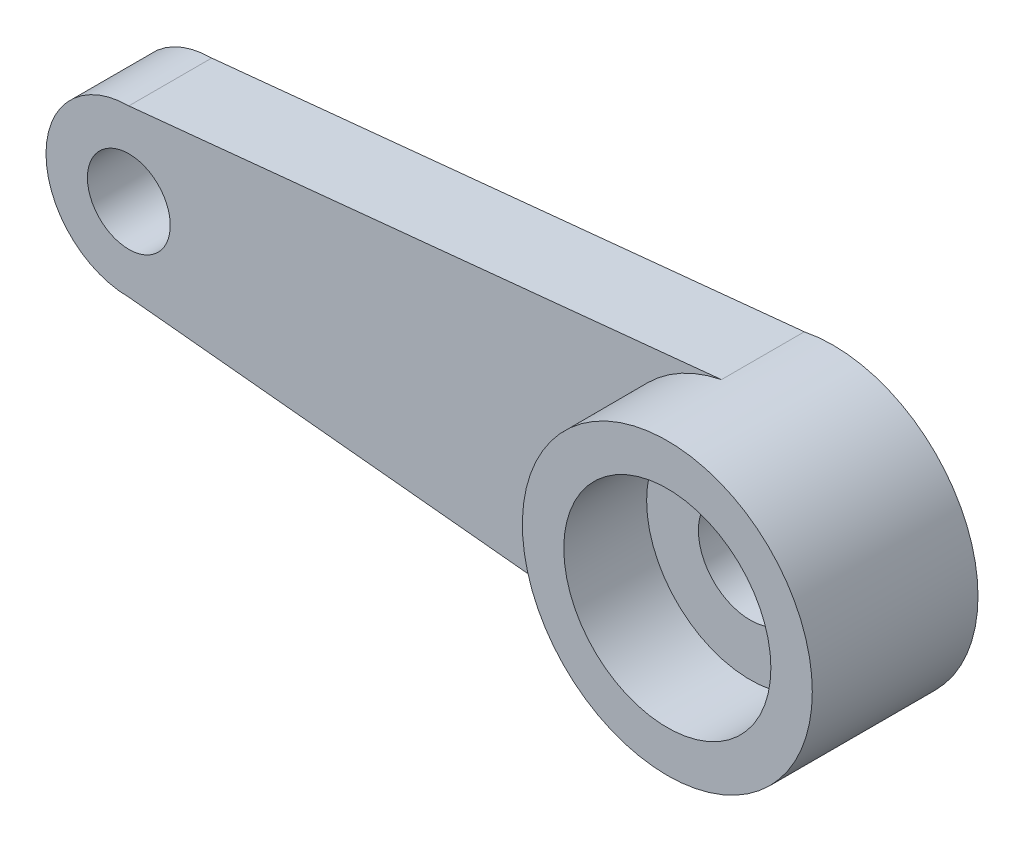
ISO-10303-21;
HEADER;
FILE_DESCRIPTION(('STEP AP214'),'2;1');
FILE_NAME('part.step','',(''),(''),'','','');
FILE_SCHEMA(('AUTOMOTIVE_DESIGN { 1 0 10303 214 1 1 1 1 }'));
ENDSEC;
DATA;
#1=APPLICATION_CONTEXT('core data for automotive mechanical design processes');
#2=APPLICATION_PROTOCOL_DEFINITION('international standard','automotive_design',2000,#1);
#3=PRODUCT_CONTEXT('',#1,'mechanical');
#4=PRODUCT('Part','Part','',(#3));
#5=PRODUCT_RELATED_PRODUCT_CATEGORY('part','',(#4));
#6=PRODUCT_DEFINITION_FORMATION('','',#4);
#7=PRODUCT_DEFINITION_CONTEXT('part definition',#1,'design');
#8=PRODUCT_DEFINITION('design','',#6,#7);
#9=PRODUCT_DEFINITION_SHAPE('','',#8);
#10=(LENGTH_UNIT() NAMED_UNIT(*) SI_UNIT(.MILLI.,.METRE.));
#11=(NAMED_UNIT(*) PLANE_ANGLE_UNIT() SI_UNIT($,.RADIAN.));
#12=(NAMED_UNIT(*) SI_UNIT($,.STERADIAN.) SOLID_ANGLE_UNIT());
#13=UNCERTAINTY_MEASURE_WITH_UNIT(LENGTH_MEASURE(1.E-05),#10,'distance_accuracy_value','');
#14=(GEOMETRIC_REPRESENTATION_CONTEXT(3) GLOBAL_UNCERTAINTY_ASSIGNED_CONTEXT((#13)) GLOBAL_UNIT_ASSIGNED_CONTEXT((#10,
#11,#12)) REPRESENTATION_CONTEXT('',''));
#15=CARTESIAN_POINT('',(0.,0.,0.));
#16=DIRECTION('',(0.,0.,1.));
#17=DIRECTION('',(1.,0.,0.));
#18=AXIS2_PLACEMENT_3D('',#15,#16,#17);
#19=CARTESIAN_POINT('',(0.,0.,4.));
#20=DIRECTION('',(0.,0.,-1.));
#21=DIRECTION('',(-1.,0.,0.));
#22=AXIS2_PLACEMENT_3D('',#19,#20,#21);
#23=CYLINDRICAL_SURFACE('',#22,2.5);
#24=CARTESIAN_POINT('',(0.,0.,4.));
#25=DIRECTION('',(0.,0.,1.));
#26=DIRECTION('',(1.,0.,0.));
#27=AXIS2_PLACEMENT_3D('',#24,#25,#26);
#28=CIRCLE('',#27,2.5);
#29=CARTESIAN_POINT('',(2.5,0.,4.));
#30=VERTEX_POINT('',#29);
#31=EDGE_CURVE('E115',#30,#30,#28,.T.);
#32=ORIENTED_EDGE('',*,*,#31,.T.);
#33=EDGE_LOOP('',(#32));
#34=FACE_BOUND('',#33,.T.);
#35=CARTESIAN_POINT('',(0.,0.,2.));
#36=DIRECTION('',(0.,0.,-1.));
#37=DIRECTION('',(-1.,0.,0.));
#38=AXIS2_PLACEMENT_3D('',#35,#36,#37);
#39=CIRCLE('',#38,2.5);
#40=CARTESIAN_POINT('',(-2.5,0.,2.));
#41=VERTEX_POINT('',#40);
#42=EDGE_CURVE('E109',#41,#41,#39,.T.);
#43=ORIENTED_EDGE('',*,*,#42,.T.);
#44=EDGE_LOOP('',(#43));
#45=FACE_BOUND('',#44,.T.);
#46=ADVANCED_FACE('F34',(#34,#45),#23,.F.);
#47=CARTESIAN_POINT('',(0.,0.,4.));
#48=DIRECTION('',(0.,0.,1.));
#49=DIRECTION('',(1.,0.,0.));
#50=AXIS2_PLACEMENT_3D('',#47,#48,#49);
#51=PLANE('',#50);
#52=CARTESIAN_POINT('',(0.,0.,4.));
#53=DIRECTION('',(0.,0.,1.));
#54=DIRECTION('',(1.,0.,0.));
#55=AXIS2_PLACEMENT_3D('',#52,#53,#54);
#56=CIRCLE('',#55,3.5);
#57=CARTESIAN_POINT('',(3.5,0.,4.));
#58=VERTEX_POINT('',#57);
#59=EDGE_CURVE('E11',#58,#58,#56,.T.);
#60=ORIENTED_EDGE('',*,*,#59,.T.);
#61=EDGE_LOOP('',(#60));
#62=FACE_BOUND('',#61,.T.);
#63=ORIENTED_EDGE('',*,*,#31,.F.);
#64=EDGE_LOOP('',(#63));
#65=FACE_BOUND('',#64,.T.);
#66=ADVANCED_FACE('F141',(#62,#65),#51,.T.);
#67=CARTESIAN_POINT('',(0.,0.,0.));
#68=DIRECTION('',(0.,0.,1.));
#69=DIRECTION('',(1.,0.,0.));
#70=AXIS2_PLACEMENT_3D('',#67,#68,#69);
#71=PLANE('',#70);
#72=CARTESIAN_POINT('',(0.,0.,0.));
#73=DIRECTION('',(0.,0.,1.));
#74=DIRECTION('',(1.,0.,0.));
#75=AXIS2_PLACEMENT_3D('',#72,#73,#74);
#76=CIRCLE('',#75,3.5);
#77=CARTESIAN_POINT('',(-0.693069306930688,-3.43069306930693,0.));
#78=VERTEX_POINT('',#77);
#79=CARTESIAN_POINT('',(-0.693069306930688,3.43069306930693,0.));
#80=VERTEX_POINT('',#79);
#81=EDGE_CURVE('E38',#78,#80,#76,.T.);
#82=ORIENTED_EDGE('',*,*,#81,.F.);
#83=DIRECTION('',(-0.995037190209989,0.0995037190209987,0.));
#84=VECTOR('',#83,1.);
#85=CARTESIAN_POINT('',(-0.346534653465346,-3.46534653465347,0.));
#86=LINE('',#85,#84);
#87=CARTESIAN_POINT('',(-15.,-2.,0.));
#88=VERTEX_POINT('',#87);
#89=EDGE_CURVE('E108',#78,#88,#86,.T.);
#90=ORIENTED_EDGE('',*,*,#89,.T.);
#91=CARTESIAN_POINT('',(-15.,0.,0.));
#92=DIRECTION('',(0.,0.,-1.));
#93=DIRECTION('',(-1.,0.,0.));
#94=AXIS2_PLACEMENT_3D('',#91,#92,#93);
#95=CIRCLE('',#94,2.);
#96=CARTESIAN_POINT('',(-15.,2.,0.));
#97=VERTEX_POINT('',#96);
#98=EDGE_CURVE('E80',#88,#97,#95,.T.);
#99=ORIENTED_EDGE('',*,*,#98,.T.);
#100=DIRECTION('',(-0.995037190209989,-0.0995037190209987,0.));
#101=VECTOR('',#100,1.);
#102=CARTESIAN_POINT('',(-0.346534653465346,3.46534653465347,0.));
#103=LINE('',#102,#101);
#104=EDGE_CURVE('E99',#80,#97,#103,.T.);
#105=ORIENTED_EDGE('',*,*,#104,.F.);
#106=EDGE_LOOP('',(#82,#90,#99,#105));
#107=FACE_BOUND('',#106,.T.);
#108=CARTESIAN_POINT('',(-15.,0.,0.));
#109=DIRECTION('',(0.,0.,-1.));
#110=DIRECTION('',(-1.,0.,0.));
#111=AXIS2_PLACEMENT_3D('',#108,#109,#110);
#112=CIRCLE('',#111,1.);
#113=CARTESIAN_POINT('',(-16.,0.,0.));
#114=VERTEX_POINT('',#113);
#115=EDGE_CURVE('E105',#114,#114,#112,.T.);
#116=ORIENTED_EDGE('',*,*,#115,.F.);
#117=EDGE_LOOP('',(#116));
#118=FACE_BOUND('',#117,.T.);
#119=CARTESIAN_POINT('',(0.,0.,0.));
#120=DIRECTION('',(0.,0.,-1.));
#121=DIRECTION('',(-1.,0.,0.));
#122=AXIS2_PLACEMENT_3D('',#119,#120,#121);
#123=CIRCLE('',#122,1.25);
#124=CARTESIAN_POINT('',(-1.25,0.,0.));
#125=VERTEX_POINT('',#124);
#126=EDGE_CURVE('E224',#125,#125,#123,.T.);
#127=ORIENTED_EDGE('',*,*,#126,.F.);
#128=EDGE_LOOP('',(#127));
#129=FACE_BOUND('',#128,.T.);
#130=ADVANCED_FACE('F124',(#107,#118,#129),#71,.F.);
#131=CARTESIAN_POINT('',(0.,0.,4.));
#132=DIRECTION('',(0.,0.,-1.));
#133=DIRECTION('',(-1.,0.,0.));
#134=AXIS2_PLACEMENT_3D('',#131,#132,#133);
#135=CYLINDRICAL_SURFACE('',#134,3.5);
#136=CARTESIAN_POINT('',(0.,0.,2.));
#137=DIRECTION('',(0.,0.,-1.));
#138=DIRECTION('',(-1.,0.,0.));
#139=AXIS2_PLACEMENT_3D('',#136,#137,#138);
#140=CIRCLE('',#139,3.5);
#141=CARTESIAN_POINT('',(-0.693069306930688,-3.43069306930693,2.));
#142=VERTEX_POINT('',#141);
#143=CARTESIAN_POINT('',(-0.693069306930688,3.43069306930693,2.));
#144=VERTEX_POINT('',#143);
#145=EDGE_CURVE('E54',#142,#144,#140,.T.);
#146=ORIENTED_EDGE('',*,*,#145,.F.);
#147=DIRECTION('',(0.,0.,-1.));
#148=VECTOR('',#147,1.);
#149=CARTESIAN_POINT('',(-0.693069306930688,-3.43069306930693,2.));
#150=LINE('',#149,#148);
#151=EDGE_CURVE('E95',#142,#78,#150,.T.);
#152=ORIENTED_EDGE('',*,*,#151,.T.);
#153=ORIENTED_EDGE('',*,*,#81,.T.);
#154=DIRECTION('',(0.,0.,-1.));
#155=VECTOR('',#154,1.);
#156=CARTESIAN_POINT('',(-0.693069306930688,3.43069306930693,2.));
#157=LINE('',#156,#155);
#158=EDGE_CURVE('E49',#144,#80,#157,.T.);
#159=ORIENTED_EDGE('',*,*,#158,.F.);
#160=EDGE_LOOP('',(#146,#152,#153,#159));
#161=FACE_BOUND('',#160,.T.);
#162=ORIENTED_EDGE('',*,*,#59,.F.);
#163=EDGE_LOOP('',(#162));
#164=FACE_BOUND('',#163,.T.);
#165=ADVANCED_FACE('F36',(#161,#164),#135,.T.);
#166=CARTESIAN_POINT('',(-0.346534653465346,-3.46534653465347,2.));
#167=DIRECTION('',(-0.0995037190209987,-0.995037190209989,0.));
#168=DIRECTION('',(0.995037190209989,-0.0995037190209987,0.));
#169=AXIS2_PLACEMENT_3D('',#166,#167,#168);
#170=PLANE('',#169);
#171=ORIENTED_EDGE('',*,*,#89,.F.);
#172=ORIENTED_EDGE('',*,*,#151,.F.);
#173=DIRECTION('',(-0.995037190209989,0.0995037190209987,0.));
#174=VECTOR('',#173,1.);
#175=CARTESIAN_POINT('',(-0.346534653465346,-3.46534653465347,2.));
#176=LINE('',#175,#174);
#177=CARTESIAN_POINT('',(-15.,-2.,2.));
#178=VERTEX_POINT('',#177);
#179=EDGE_CURVE('E90',#142,#178,#176,.T.);
#180=ORIENTED_EDGE('',*,*,#179,.T.);
#181=DIRECTION('',(0.,0.,-1.));
#182=VECTOR('',#181,1.);
#183=CARTESIAN_POINT('',(-15.,-2.,2.));
#184=LINE('',#183,#182);
#185=EDGE_CURVE('E75',#178,#88,#184,.T.);
#186=ORIENTED_EDGE('',*,*,#185,.T.);
#187=EDGE_LOOP('',(#171,#172,#180,#186));
#188=FACE_BOUND('',#187,.T.);
#189=ADVANCED_FACE('F94',(#188),#170,.T.);
#190=CARTESIAN_POINT('',(-0.346534653465346,3.46534653465347,2.));
#191=DIRECTION('',(0.0995037190209987,-0.995037190209989,0.));
#192=DIRECTION('',(0.995037190209989,0.0995037190209987,0.));
#193=AXIS2_PLACEMENT_3D('',#190,#191,#192);
#194=PLANE('',#193);
#195=ORIENTED_EDGE('',*,*,#104,.T.);
#196=DIRECTION('',(0.,0.,-1.));
#197=VECTOR('',#196,1.);
#198=CARTESIAN_POINT('',(-15.,2.,2.));
#199=LINE('',#198,#197);
#200=CARTESIAN_POINT('',(-15.,2.,2.));
#201=VERTEX_POINT('',#200);
#202=EDGE_CURVE('E85',#201,#97,#199,.T.);
#203=ORIENTED_EDGE('',*,*,#202,.F.);
#204=DIRECTION('',(-0.995037190209989,-0.0995037190209987,0.));
#205=VECTOR('',#204,1.);
#206=CARTESIAN_POINT('',(-0.346534653465346,3.46534653465347,2.));
#207=LINE('',#206,#205);
#208=EDGE_CURVE('E91',#144,#201,#207,.T.);
#209=ORIENTED_EDGE('',*,*,#208,.F.);
#210=ORIENTED_EDGE('',*,*,#158,.T.);
#211=EDGE_LOOP('',(#195,#203,#209,#210));
#212=FACE_BOUND('',#211,.T.);
#213=ADVANCED_FACE('F127',(#212),#194,.F.);
#214=CARTESIAN_POINT('',(-15.,0.,2.));
#215=DIRECTION('',(0.,0.,-1.));
#216=DIRECTION('',(-1.,0.,0.));
#217=AXIS2_PLACEMENT_3D('',#214,#215,#216);
#218=CYLINDRICAL_SURFACE('',#217,1.);
#219=CARTESIAN_POINT('',(-15.,0.,2.));
#220=DIRECTION('',(0.,0.,-1.));
#221=DIRECTION('',(-1.,0.,0.));
#222=AXIS2_PLACEMENT_3D('',#219,#220,#221);
#223=CIRCLE('',#222,1.);
#224=CARTESIAN_POINT('',(-16.,0.,2.));
#225=VERTEX_POINT('',#224);
#226=EDGE_CURVE('E96',#225,#225,#223,.T.);
#227=ORIENTED_EDGE('',*,*,#226,.F.);
#228=EDGE_LOOP('',(#227));
#229=FACE_BOUND('',#228,.T.);
#230=ORIENTED_EDGE('',*,*,#115,.T.);
#231=EDGE_LOOP('',(#230));
#232=FACE_BOUND('',#231,.T.);
#233=ADVANCED_FACE('F129',(#229,#232),#218,.F.);
#234=CARTESIAN_POINT('',(-15.,0.,2.));
#235=DIRECTION('',(0.,0.,-1.));
#236=DIRECTION('',(-1.,0.,0.));
#237=AXIS2_PLACEMENT_3D('',#234,#235,#236);
#238=CYLINDRICAL_SURFACE('',#237,2.);
#239=ORIENTED_EDGE('',*,*,#98,.F.);
#240=ORIENTED_EDGE('',*,*,#185,.F.);
#241=CARTESIAN_POINT('',(-15.,0.,2.));
#242=DIRECTION('',(0.,0.,-1.));
#243=DIRECTION('',(-1.,0.,0.));
#244=AXIS2_PLACEMENT_3D('',#241,#242,#243);
#245=CIRCLE('',#244,2.);
#246=EDGE_CURVE('E78',#178,#201,#245,.T.);
#247=ORIENTED_EDGE('',*,*,#246,.T.);
#248=ORIENTED_EDGE('',*,*,#202,.T.);
#249=EDGE_LOOP('',(#239,#240,#247,#248));
#250=FACE_BOUND('',#249,.T.);
#251=ADVANCED_FACE('F77',(#250),#238,.T.);
#252=CARTESIAN_POINT('',(0.,0.,2.));
#253=DIRECTION('',(0.,0.,-1.));
#254=DIRECTION('',(-1.,0.,0.));
#255=AXIS2_PLACEMENT_3D('',#252,#253,#254);
#256=PLANE('',#255);
#257=ORIENTED_EDGE('',*,*,#226,.T.);
#258=EDGE_LOOP('',(#257));
#259=FACE_BOUND('',#258,.T.);
#260=ORIENTED_EDGE('',*,*,#179,.F.);
#261=ORIENTED_EDGE('',*,*,#145,.T.);
#262=ORIENTED_EDGE('',*,*,#208,.T.);
#263=ORIENTED_EDGE('',*,*,#246,.F.);
#264=EDGE_LOOP('',(#260,#261,#262,#263));
#265=FACE_BOUND('',#264,.T.);
#266=ADVANCED_FACE('F89',(#259,#265),#256,.F.);
#267=CARTESIAN_POINT('',(0.,0.,2.));
#268=DIRECTION('',(0.,0.,-1.));
#269=DIRECTION('',(-1.,0.,0.));
#270=AXIS2_PLACEMENT_3D('',#267,#268,#269);
#271=PLANE('',#270);
#272=CARTESIAN_POINT('',(0.,0.,2.));
#273=DIRECTION('',(0.,0.,-1.));
#274=DIRECTION('',(-1.,0.,0.));
#275=AXIS2_PLACEMENT_3D('',#272,#273,#274);
#276=CIRCLE('',#275,1.25);
#277=CARTESIAN_POINT('',(-1.25,0.,2.));
#278=VERTEX_POINT('',#277);
#279=EDGE_CURVE('E221',#278,#278,#276,.T.);
#280=ORIENTED_EDGE('',*,*,#279,.T.);
#281=EDGE_LOOP('',(#280));
#282=FACE_BOUND('',#281,.T.);
#283=ORIENTED_EDGE('',*,*,#42,.F.);
#284=EDGE_LOOP('',(#283));
#285=FACE_BOUND('',#284,.T.);
#286=ADVANCED_FACE('F186',(#282,#285),#271,.F.);
#287=CARTESIAN_POINT('',(0.,0.,2.));
#288=DIRECTION('',(0.,0.,-1.));
#289=DIRECTION('',(-1.,0.,0.));
#290=AXIS2_PLACEMENT_3D('',#287,#288,#289);
#291=CYLINDRICAL_SURFACE('',#290,1.25);
#292=ORIENTED_EDGE('',*,*,#279,.F.);
#293=EDGE_LOOP('',(#292));
#294=FACE_BOUND('',#293,.T.);
#295=ORIENTED_EDGE('',*,*,#126,.T.);
#296=EDGE_LOOP('',(#295));
#297=FACE_BOUND('',#296,.T.);
#298=ADVANCED_FACE('F204',(#294,#297),#291,.F.);
#299=CLOSED_SHELL('',(#46,#66,#130,#165,#189,#213,#233,#251,#266,#286,#298));
#300=MANIFOLD_SOLID_BREP('B2',#299);
#301=ADVANCED_BREP_SHAPE_REPRESENTATION('',(#18,#300),#14);
#302=SHAPE_DEFINITION_REPRESENTATION(#9,#301);
ENDSEC;
END-ISO-10303-21;
